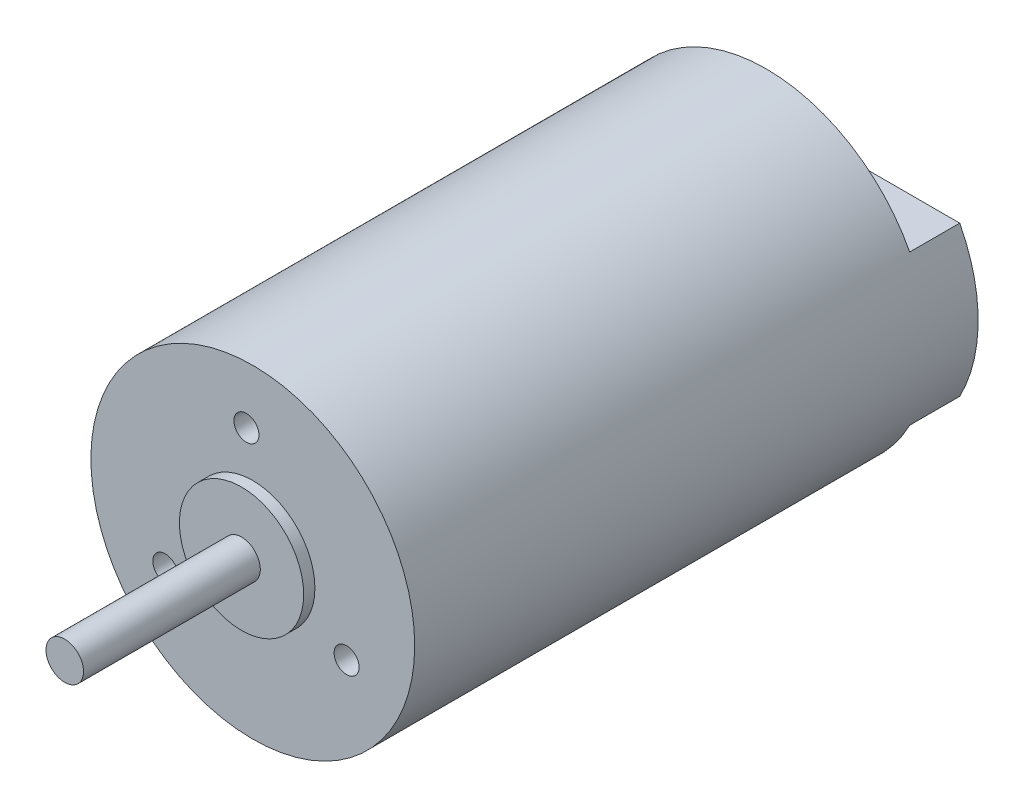
ISO-10303-21;
HEADER;
FILE_DESCRIPTION(('STEP AP214'),'2;1');
FILE_NAME('part.step','',(''),(''),'','','');
FILE_SCHEMA(('AUTOMOTIVE_DESIGN { 1 0 10303 214 1 1 1 1 }'));
ENDSEC;
DATA;
#1=APPLICATION_CONTEXT('core data for automotive mechanical design processes');
#2=APPLICATION_PROTOCOL_DEFINITION('international standard','automotive_design',2000,#1);
#3=PRODUCT_CONTEXT('',#1,'mechanical');
#4=PRODUCT('Part','Part','',(#3));
#5=PRODUCT_RELATED_PRODUCT_CATEGORY('part','',(#4));
#6=PRODUCT_DEFINITION_FORMATION('','',#4);
#7=PRODUCT_DEFINITION_CONTEXT('part definition',#1,'design');
#8=PRODUCT_DEFINITION('design','',#6,#7);
#9=PRODUCT_DEFINITION_SHAPE('','',#8);
#10=(LENGTH_UNIT() NAMED_UNIT(*) SI_UNIT(.MILLI.,.METRE.));
#11=(NAMED_UNIT(*) PLANE_ANGLE_UNIT() SI_UNIT($,.RADIAN.));
#12=(NAMED_UNIT(*) SI_UNIT($,.STERADIAN.) SOLID_ANGLE_UNIT());
#13=UNCERTAINTY_MEASURE_WITH_UNIT(LENGTH_MEASURE(1.E-05),#10,'distance_accuracy_value','');
#14=(GEOMETRIC_REPRESENTATION_CONTEXT(3) GLOBAL_UNCERTAINTY_ASSIGNED_CONTEXT((#13)) GLOBAL_UNIT_ASSIGNED_CONTEXT((#10,
#11,#12)) REPRESENTATION_CONTEXT('',''));
#15=CARTESIAN_POINT('',(0.,0.,0.));
#16=DIRECTION('',(0.,0.,1.));
#17=DIRECTION('',(1.,0.,0.));
#18=AXIS2_PLACEMENT_3D('',#15,#16,#17);
#19=CARTESIAN_POINT('',(0.,0.,0.));
#20=DIRECTION('',(0.,0.,1.));
#21=DIRECTION('',(1.,0.,0.));
#22=AXIS2_PLACEMENT_3D('',#19,#20,#21);
#23=PLANE('',#22);
#24=DIRECTION('',(-1.,0.,0.));
#25=VECTOR('',#24,1.);
#26=CARTESIAN_POINT('',(0.,-6.,0.));
#27=LINE('',#26,#25);
#28=CARTESIAN_POINT('',(11.4761709642197,-6.,0.));
#29=VERTEX_POINT('',#28);
#30=CARTESIAN_POINT('',(-11.4761709642197,-6.,0.));
#31=VERTEX_POINT('',#30);
#32=EDGE_CURVE('E49',#29,#31,#27,.T.);
#33=ORIENTED_EDGE('',*,*,#32,.F.);
#34=CARTESIAN_POINT('',(0.,0.,0.));
#35=DIRECTION('',(0.,0.,1.));
#36=DIRECTION('',(1.,0.,0.));
#37=AXIS2_PLACEMENT_3D('',#34,#35,#36);
#38=CIRCLE('',#37,12.95);
#39=EDGE_CURVE('E128',#31,#29,#38,.T.);
#40=ORIENTED_EDGE('',*,*,#39,.F.);
#41=EDGE_LOOP('',(#33,#40));
#42=FACE_BOUND('',#41,.T.);
#43=ADVANCED_FACE('F33',(#42),#23,.F.);
#44=CARTESIAN_POINT('',(0.,0.,41.97));
#45=DIRECTION('',(0.,0.,1.));
#46=DIRECTION('',(1.,0.,0.));
#47=AXIS2_PLACEMENT_3D('',#44,#45,#46);
#48=PLANE('',#47);
#49=CARTESIAN_POINT('',(0.,0.,41.97));
#50=DIRECTION('',(0.,0.,1.));
#51=DIRECTION('',(1.,0.,0.));
#52=AXIS2_PLACEMENT_3D('',#49,#50,#51);
#53=CIRCLE('',#52,4.97);
#54=CARTESIAN_POINT('',(4.97,0.,41.97));
#55=VERTEX_POINT('',#54);
#56=EDGE_CURVE('E130',#55,#55,#53,.T.);
#57=ORIENTED_EDGE('',*,*,#56,.T.);
#58=EDGE_LOOP('',(#57));
#59=FACE_BOUND('',#58,.T.);
#60=CARTESIAN_POINT('',(0.,0.,41.97));
#61=DIRECTION('',(0.,0.,1.));
#62=DIRECTION('',(1.,0.,0.));
#63=AXIS2_PLACEMENT_3D('',#60,#61,#62);
#64=CIRCLE('',#63,1.5);
#65=CARTESIAN_POINT('',(-1.5,0.,41.97));
#66=VERTEX_POINT('',#65);
#67=EDGE_CURVE('E141',#66,#66,#64,.T.);
#68=ORIENTED_EDGE('',*,*,#67,.F.);
#69=EDGE_LOOP('',(#68));
#70=FACE_BOUND('',#69,.T.);
#71=ADVANCED_FACE('F168',(#59,#70),#48,.T.);
#72=CARTESIAN_POINT('',(0.,0.,41.07));
#73=DIRECTION('',(0.,0.,1.));
#74=DIRECTION('',(1.,0.,0.));
#75=AXIS2_PLACEMENT_3D('',#72,#73,#74);
#76=PLANE('',#75);
#77=CARTESIAN_POINT('',(-0.508072965356447,8.36131323140124,41.07));
#78=DIRECTION('',(0.,0.,1.));
#79=DIRECTION('',(1.,0.,0.));
#80=AXIS2_PLACEMENT_3D('',#77,#78,#79);
#81=CIRCLE('',#80,0.999999999999989);
#82=CARTESIAN_POINT('',(0.491927034643542,8.36131323140124,41.07));
#83=VERTEX_POINT('',#82);
#84=EDGE_CURVE('E92',#83,#83,#81,.T.);
#85=ORIENTED_EDGE('',*,*,#84,.F.);
#86=EDGE_LOOP('',(#85));
#87=FACE_BOUND('',#86,.T.);
#88=CARTESIAN_POINT('',(7.50309849036857,-3.72467584301782,41.07));
#89=DIRECTION('',(0.,0.,1.));
#90=DIRECTION('',(1.,0.,0.));
#91=AXIS2_PLACEMENT_3D('',#88,#89,#90);
#92=CIRCLE('',#91,0.99999999999999);
#93=CARTESIAN_POINT('',(8.50309849036856,-3.72467584301782,41.07));
#94=VERTEX_POINT('',#93);
#95=EDGE_CURVE('E155',#94,#94,#92,.T.);
#96=ORIENTED_EDGE('',*,*,#95,.F.);
#97=EDGE_LOOP('',(#96));
#98=FACE_BOUND('',#97,.T.);
#99=CARTESIAN_POINT('',(-6.99690150963143,-4.60576447034028,41.07));
#100=DIRECTION('',(0.,0.,1.));
#101=DIRECTION('',(1.,0.,0.));
#102=AXIS2_PLACEMENT_3D('',#99,#100,#101);
#103=CIRCLE('',#102,0.999999999999989);
#104=CARTESIAN_POINT('',(-5.99690150963144,-4.60576447034028,41.07));
#105=VERTEX_POINT('',#104);
#106=EDGE_CURVE('E149',#105,#105,#103,.T.);
#107=ORIENTED_EDGE('',*,*,#106,.F.);
#108=EDGE_LOOP('',(#107));
#109=FACE_BOUND('',#108,.T.);
#110=CARTESIAN_POINT('',(0.,0.,41.07));
#111=DIRECTION('',(0.,0.,1.));
#112=DIRECTION('',(1.,0.,0.));
#113=AXIS2_PLACEMENT_3D('',#110,#111,#112);
#114=CIRCLE('',#113,12.95);
#115=CARTESIAN_POINT('',(12.95,0.,41.07));
#116=VERTEX_POINT('',#115);
#117=EDGE_CURVE('E11',#116,#116,#114,.T.);
#118=ORIENTED_EDGE('',*,*,#117,.T.);
#119=EDGE_LOOP('',(#118));
#120=FACE_BOUND('',#119,.T.);
#121=CARTESIAN_POINT('',(0.,0.,41.07));
#122=DIRECTION('',(0.,0.,1.));
#123=DIRECTION('',(1.,0.,0.));
#124=AXIS2_PLACEMENT_3D('',#121,#122,#123);
#125=CIRCLE('',#124,4.97);
#126=CARTESIAN_POINT('',(4.97,0.,41.07));
#127=VERTEX_POINT('',#126);
#128=EDGE_CURVE('E135',#127,#127,#125,.T.);
#129=ORIENTED_EDGE('',*,*,#128,.F.);
#130=EDGE_LOOP('',(#129));
#131=FACE_BOUND('',#130,.T.);
#132=ADVANCED_FACE('F165',(#87,#98,#109,#120,#131),#76,.T.);
#133=CARTESIAN_POINT('',(0.,0.,41.07));
#134=DIRECTION('',(0.,0.,-1.));
#135=DIRECTION('',(-1.,0.,0.));
#136=AXIS2_PLACEMENT_3D('',#133,#134,#135);
#137=CYLINDRICAL_SURFACE('',#136,12.95);
#138=ORIENTED_EDGE('',*,*,#117,.F.);
#139=EDGE_LOOP('',(#138));
#140=FACE_BOUND('',#139,.T.);
#141=CARTESIAN_POINT('',(11.4761709642197,6.,0.));
#142=VERTEX_POINT('',#141);
#143=CARTESIAN_POINT('',(-11.4761709642197,6.,0.));
#144=VERTEX_POINT('',#143);
#145=EDGE_CURVE('E42',#142,#144,#38,.T.);
#146=ORIENTED_EDGE('',*,*,#145,.T.);
#147=DIRECTION('',(0.,0.,1.));
#148=VECTOR('',#147,1.);
#149=CARTESIAN_POINT('',(-11.4761709642197,6.,-4.));
#150=LINE('',#149,#148);
#151=CARTESIAN_POINT('',(-11.4761709642197,6.,-4.));
#152=VERTEX_POINT('',#151);
#153=EDGE_CURVE('E117',#152,#144,#150,.T.);
#154=ORIENTED_EDGE('',*,*,#153,.F.);
#155=CARTESIAN_POINT('',(0.,0.,-4.));
#156=DIRECTION('',(0.,0.,-1.));
#157=DIRECTION('',(-1.,0.,0.));
#158=AXIS2_PLACEMENT_3D('',#155,#156,#157);
#159=CIRCLE('',#158,12.95);
#160=CARTESIAN_POINT('',(-11.4761709642197,-6.,-4.));
#161=VERTEX_POINT('',#160);
#162=EDGE_CURVE('E102',#161,#152,#159,.T.);
#163=ORIENTED_EDGE('',*,*,#162,.F.);
#164=DIRECTION('',(0.,0.,1.));
#165=VECTOR('',#164,1.);
#166=CARTESIAN_POINT('',(-11.4761709642197,-6.,-4.));
#167=LINE('',#166,#165);
#168=EDGE_CURVE('E118',#161,#31,#167,.T.);
#169=ORIENTED_EDGE('',*,*,#168,.T.);
#170=ORIENTED_EDGE('',*,*,#39,.T.);
#171=DIRECTION('',(0.,0.,1.));
#172=VECTOR('',#171,1.);
#173=CARTESIAN_POINT('',(11.4761709642197,-6.,-4.));
#174=LINE('',#173,#172);
#175=CARTESIAN_POINT('',(11.4761709642197,-6.,-4.));
#176=VERTEX_POINT('',#175);
#177=EDGE_CURVE('E93',#176,#29,#174,.T.);
#178=ORIENTED_EDGE('',*,*,#177,.F.);
#179=CARTESIAN_POINT('',(11.4761709642197,6.,-4.));
#180=VERTEX_POINT('',#179);
#181=EDGE_CURVE('E96',#180,#176,#159,.T.);
#182=ORIENTED_EDGE('',*,*,#181,.F.);
#183=DIRECTION('',(0.,0.,1.));
#184=VECTOR('',#183,1.);
#185=CARTESIAN_POINT('',(11.4761709642197,6.,-4.));
#186=LINE('',#185,#184);
#187=EDGE_CURVE('E85',#180,#142,#186,.T.);
#188=ORIENTED_EDGE('',*,*,#187,.T.);
#189=EDGE_LOOP('',(#146,#154,#163,#169,#170,#178,#182,#188));
#190=FACE_BOUND('',#189,.T.);
#191=ADVANCED_FACE('F35',(#140,#190),#137,.T.);
#192=ORIENTED_EDGE('',*,*,#145,.F.);
#193=DIRECTION('',(-1.,0.,0.));
#194=VECTOR('',#193,1.);
#195=CARTESIAN_POINT('',(0.,6.,0.));
#196=LINE('',#195,#194);
#197=EDGE_CURVE('E56',#142,#144,#196,.T.);
#198=ORIENTED_EDGE('',*,*,#197,.T.);
#199=EDGE_LOOP('',(#192,#198));
#200=FACE_BOUND('',#199,.T.);
#201=ADVANCED_FACE('F181',(#200),#23,.F.);
#202=CARTESIAN_POINT('',(0.,0.,41.97));
#203=DIRECTION('',(0.,0.,-1.));
#204=DIRECTION('',(-1.,0.,0.));
#205=AXIS2_PLACEMENT_3D('',#202,#203,#204);
#206=CYLINDRICAL_SURFACE('',#205,4.97);
#207=ORIENTED_EDGE('',*,*,#56,.F.);
#208=EDGE_LOOP('',(#207));
#209=FACE_BOUND('',#208,.T.);
#210=ORIENTED_EDGE('',*,*,#128,.T.);
#211=EDGE_LOOP('',(#210));
#212=FACE_BOUND('',#211,.T.);
#213=ADVANCED_FACE('F178',(#209,#212),#206,.T.);
#214=CARTESIAN_POINT('',(0.,0.,56.11));
#215=DIRECTION('',(0.,0.,-1.));
#216=DIRECTION('',(-1.,0.,0.));
#217=AXIS2_PLACEMENT_3D('',#214,#215,#216);
#218=CYLINDRICAL_SURFACE('',#217,1.5);
#219=CARTESIAN_POINT('',(0.,0.,56.11));
#220=DIRECTION('',(0.,0.,1.));
#221=DIRECTION('',(1.,0.,0.));
#222=AXIS2_PLACEMENT_3D('',#219,#220,#221);
#223=CIRCLE('',#222,1.5);
#224=CARTESIAN_POINT('',(-1.5,0.,56.11));
#225=VERTEX_POINT('',#224);
#226=EDGE_CURVE('E138',#225,#225,#223,.T.);
#227=CARTESIAN_POINT('',(-1.5,0.,56.11));
#228=CARTESIAN_POINT('',(-1.5,0.,55.9627083333333));
#229=CARTESIAN_POINT('',(-1.5,0.,55.8154166666667));
#230=CARTESIAN_POINT('',(-1.5,0.,55.5208333333333));
#231=CARTESIAN_POINT('',(-1.5,0.,55.3735416666667));
#232=CARTESIAN_POINT('',(-1.5,0.,55.0789583333333));
#233=CARTESIAN_POINT('',(-1.5,0.,54.9316666666667));
#234=CARTESIAN_POINT('',(-1.5,0.,54.6370833333333));
#235=CARTESIAN_POINT('',(-1.5,0.,54.4897916666667));
#236=CARTESIAN_POINT('',(-1.5,0.,54.1952083333333));
#237=CARTESIAN_POINT('',(-1.5,0.,54.0479166666667));
#238=CARTESIAN_POINT('',(-1.5,0.,53.7533333333333));
#239=CARTESIAN_POINT('',(-1.5,0.,53.6060416666667));
#240=CARTESIAN_POINT('',(-1.5,0.,53.3114583333333));
#241=CARTESIAN_POINT('',(-1.5,0.,53.1641666666667));
#242=CARTESIAN_POINT('',(-1.5,0.,52.8695833333333));
#243=CARTESIAN_POINT('',(-1.5,0.,52.7222916666667));
#244=CARTESIAN_POINT('',(-1.5,0.,52.4277083333333));
#245=CARTESIAN_POINT('',(-1.5,0.,52.2804166666667));
#246=CARTESIAN_POINT('',(-1.5,0.,51.9858333333333));
#247=CARTESIAN_POINT('',(-1.5,0.,51.8385416666667));
#248=CARTESIAN_POINT('',(-1.5,0.,51.5439583333333));
#249=CARTESIAN_POINT('',(-1.5,0.,51.3966666666667));
#250=CARTESIAN_POINT('',(-1.5,0.,51.1020833333333));
#251=CARTESIAN_POINT('',(-1.5,0.,50.9547916666667));
#252=CARTESIAN_POINT('',(-1.5,0.,50.6602083333333));
#253=CARTESIAN_POINT('',(-1.5,0.,50.5129166666667));
#254=CARTESIAN_POINT('',(-1.5,0.,50.2183333333333));
#255=CARTESIAN_POINT('',(-1.5,0.,50.0710416666667));
#256=CARTESIAN_POINT('',(-1.5,0.,49.7764583333333));
#257=CARTESIAN_POINT('',(-1.5,0.,49.6291666666667));
#258=CARTESIAN_POINT('',(-1.5,0.,49.3345833333333));
#259=CARTESIAN_POINT('',(-1.5,0.,49.1872916666667));
#260=CARTESIAN_POINT('',(-1.5,0.,48.8927083333333));
#261=CARTESIAN_POINT('',(-1.5,0.,48.7454166666667));
#262=CARTESIAN_POINT('',(-1.5,0.,48.4508333333333));
#263=CARTESIAN_POINT('',(-1.5,0.,48.3035416666667));
#264=CARTESIAN_POINT('',(-1.5,0.,48.0089583333333));
#265=CARTESIAN_POINT('',(-1.5,0.,47.8616666666667));
#266=CARTESIAN_POINT('',(-1.5,0.,47.5670833333333));
#267=CARTESIAN_POINT('',(-1.5,0.,47.4197916666667));
#268=CARTESIAN_POINT('',(-1.5,0.,47.1252083333333));
#269=CARTESIAN_POINT('',(-1.5,0.,46.9779166666667));
#270=CARTESIAN_POINT('',(-1.5,0.,46.6833333333333));
#271=CARTESIAN_POINT('',(-1.5,0.,46.5360416666667));
#272=CARTESIAN_POINT('',(-1.5,0.,46.2414583333333));
#273=CARTESIAN_POINT('',(-1.5,0.,46.0941666666667));
#274=CARTESIAN_POINT('',(-1.5,0.,45.7995833333333));
#275=CARTESIAN_POINT('',(-1.5,0.,45.6522916666667));
#276=CARTESIAN_POINT('',(-1.5,0.,45.3577083333333));
#277=CARTESIAN_POINT('',(-1.5,0.,45.2104166666667));
#278=CARTESIAN_POINT('',(-1.5,0.,44.9158333333333));
#279=CARTESIAN_POINT('',(-1.5,0.,44.7685416666667));
#280=CARTESIAN_POINT('',(-1.5,0.,44.4739583333333));
#281=CARTESIAN_POINT('',(-1.5,0.,44.3266666666667));
#282=CARTESIAN_POINT('',(-1.5,0.,44.0320833333333));
#283=CARTESIAN_POINT('',(-1.5,0.,43.8847916666667));
#284=CARTESIAN_POINT('',(-1.5,0.,43.5902083333333));
#285=CARTESIAN_POINT('',(-1.5,0.,43.4429166666667));
#286=CARTESIAN_POINT('',(-1.5,0.,43.1483333333333));
#287=CARTESIAN_POINT('',(-1.5,0.,43.0010416666667));
#288=CARTESIAN_POINT('',(-1.5,0.,42.7064583333333));
#289=CARTESIAN_POINT('',(-1.5,0.,42.5591666666667));
#290=CARTESIAN_POINT('',(-1.5,0.,42.2645833333333));
#291=CARTESIAN_POINT('',(-1.5,0.,42.1172916666667));
#292=CARTESIAN_POINT('',(-1.5,0.,41.97));
#293=B_SPLINE_CURVE_WITH_KNOTS('',3,(#227,#228,#229,#230,#231,#232,#233,#234,#235,#236,#237,
#238,#239,#240,#241,#242,#243,#244,#245,#246,#247,#248,#249,#250,#251,#252,#253,#254,#255,#256,
#257,#258,#259,#260,#261,#262,#263,#264,#265,#266,#267,#268,#269,#270,#271,#272,#273,#274,#275,
#276,#277,#278,#279,#280,#281,#282,#283,#284,#285,#286,#287,#288,#289,#290,#291,#292),
.UNSPECIFIED.,.F.,.F.,(4,2,2,2,2,2,2,2,2,2,2,2,2,2,2,2,2,2,2,2,2,2,2,2,2,2,2,2,2,2,2,2,4),(0.,
0.441875000000001,0.883750000000003,1.325625,1.76750000000001,2.20937500000001,2.65125,3.093125,
3.535,3.976875,4.41875000000001,4.860625,5.3025,5.744375,6.18625,6.62812500000001,7.07,7.511875,
7.95375,8.395625,8.83750000000001,9.279375,9.72125,10.163125,10.605,11.046875,11.48875,
11.930625,12.3725,12.814375,13.25625,13.698125,14.14),.UNSPECIFIED.);
#294=EDGE_CURVE('BSEAM180',#225,#66,#293,.T.);
#295=ORIENTED_EDGE('',*,*,#226,.F.);
#296=ORIENTED_EDGE('',*,*,#67,.T.);
#297=ORIENTED_EDGE('',*,*,#294,.T.);
#298=ORIENTED_EDGE('',*,*,#294,.F.);
#299=EDGE_LOOP('',(#295,#297,#296,#298));
#300=FACE_BOUND('',#299,.T.);
#301=ADVANCED_FACE('F180',(#300),#218,.T.);
#302=CARTESIAN_POINT('',(0.,0.,56.11));
#303=DIRECTION('',(0.,0.,1.));
#304=DIRECTION('',(1.,0.,0.));
#305=AXIS2_PLACEMENT_3D('',#302,#303,#304);
#306=PLANE('',#305);
#307=ORIENTED_EDGE('',*,*,#226,.T.);
#308=EDGE_LOOP('',(#307));
#309=FACE_BOUND('',#308,.T.);
#310=ADVANCED_FACE('F188',(#309),#306,.T.);
#311=CARTESIAN_POINT('',(-6.99690150963143,-4.60576447034028,36.07));
#312=DIRECTION('',(0.,0.,1.));
#313=DIRECTION('',(1.,0.,0.));
#314=AXIS2_PLACEMENT_3D('',#311,#312,#313);
#315=CONICAL_SURFACE('',#314,0.999999999999999,1.02974425867665);
#316=CARTESIAN_POINT('',(-6.99690150963144,-4.60576447034028,35.4691393809724));
#317=VERTEX_POINT('',#316);
#318=VERTEX_LOOP('',#317);
#319=FACE_BOUND('',#318,.T.);
#320=CARTESIAN_POINT('',(-6.99690150963143,-4.60576447034028,36.07));
#321=DIRECTION('',(0.,0.,1.));
#322=DIRECTION('',(1.,0.,0.));
#323=AXIS2_PLACEMENT_3D('',#320,#321,#322);
#324=CIRCLE('',#323,0.999999999999999);
#325=CARTESIAN_POINT('',(-5.99690150963143,-4.60576447034028,36.07));
#326=VERTEX_POINT('',#325);
#327=EDGE_CURVE('E144',#326,#326,#324,.T.);
#328=ORIENTED_EDGE('',*,*,#327,.T.);
#329=EDGE_LOOP('',(#328));
#330=FACE_BOUND('',#329,.T.);
#331=ADVANCED_FACE('F204',(#319,#330),#315,.F.);
#332=CARTESIAN_POINT('',(-6.99690150963143,-4.60576447034028,41.07));
#333=DIRECTION('',(0.,0.,1.));
#334=DIRECTION('',(1.,0.,0.));
#335=AXIS2_PLACEMENT_3D('',#332,#333,#334);
#336=CYLINDRICAL_SURFACE('',#335,0.999999999999994);
#337=ORIENTED_EDGE('',*,*,#327,.F.);
#338=EDGE_LOOP('',(#337));
#339=FACE_BOUND('',#338,.T.);
#340=ORIENTED_EDGE('',*,*,#106,.T.);
#341=EDGE_LOOP('',(#340));
#342=FACE_BOUND('',#341,.T.);
#343=ADVANCED_FACE('F208',(#339,#342),#336,.F.);
#344=CARTESIAN_POINT('',(7.50309849036857,-3.72467584301782,36.07));
#345=DIRECTION('',(0.,0.,1.));
#346=DIRECTION('',(1.,0.,0.));
#347=AXIS2_PLACEMENT_3D('',#344,#345,#346);
#348=CONICAL_SURFACE('',#347,0.999999999999998,1.02974425867665);
#349=CARTESIAN_POINT('',(7.50309849036856,-3.72467584301782,35.4691393809724));
#350=VERTEX_POINT('',#349);
#351=VERTEX_LOOP('',#350);
#352=FACE_BOUND('',#351,.T.);
#353=CARTESIAN_POINT('',(7.50309849036857,-3.72467584301782,36.07));
#354=DIRECTION('',(0.,0.,1.));
#355=DIRECTION('',(1.,0.,0.));
#356=AXIS2_PLACEMENT_3D('',#353,#354,#355);
#357=CIRCLE('',#356,0.999999999999998);
#358=CARTESIAN_POINT('',(8.50309849036856,-3.72467584301782,36.07));
#359=VERTEX_POINT('',#358);
#360=EDGE_CURVE('E152',#359,#359,#357,.T.);
#361=ORIENTED_EDGE('',*,*,#360,.T.);
#362=EDGE_LOOP('',(#361));
#363=FACE_BOUND('',#362,.T.);
#364=ADVANCED_FACE('F212',(#352,#363),#348,.F.);
#365=CARTESIAN_POINT('',(7.50309849036857,-3.72467584301782,41.07));
#366=DIRECTION('',(0.,0.,1.));
#367=DIRECTION('',(1.,0.,0.));
#368=AXIS2_PLACEMENT_3D('',#365,#366,#367);
#369=CYLINDRICAL_SURFACE('',#368,0.999999999999994);
#370=ORIENTED_EDGE('',*,*,#360,.F.);
#371=EDGE_LOOP('',(#370));
#372=FACE_BOUND('',#371,.T.);
#373=ORIENTED_EDGE('',*,*,#95,.T.);
#374=EDGE_LOOP('',(#373));
#375=FACE_BOUND('',#374,.T.);
#376=ADVANCED_FACE('F216',(#372,#375),#369,.F.);
#377=CARTESIAN_POINT('',(-0.508072965356447,8.36131323140124,36.07));
#378=DIRECTION('',(0.,0.,1.));
#379=DIRECTION('',(1.,0.,0.));
#380=AXIS2_PLACEMENT_3D('',#377,#378,#379);
#381=CONICAL_SURFACE('',#380,0.999999999999999,1.02974425867665);
#382=CARTESIAN_POINT('',(-0.508072965356448,8.36131323140124,35.4691393809724));
#383=VERTEX_POINT('',#382);
#384=VERTEX_LOOP('',#383);
#385=FACE_BOUND('',#384,.T.);
#386=CARTESIAN_POINT('',(-0.508072965356447,8.36131323140124,36.07));
#387=DIRECTION('',(0.,0.,1.));
#388=DIRECTION('',(1.,0.,0.));
#389=AXIS2_PLACEMENT_3D('',#386,#387,#388);
#390=CIRCLE('',#389,0.999999999999999);
#391=CARTESIAN_POINT('',(0.491927034643552,8.36131323140124,36.07));
#392=VERTEX_POINT('',#391);
#393=EDGE_CURVE('E158',#392,#392,#390,.T.);
#394=ORIENTED_EDGE('',*,*,#393,.T.);
#395=EDGE_LOOP('',(#394));
#396=FACE_BOUND('',#395,.T.);
#397=ADVANCED_FACE('F220',(#385,#396),#381,.F.);
#398=CARTESIAN_POINT('',(-0.508072965356447,8.36131323140124,41.07));
#399=DIRECTION('',(0.,0.,1.));
#400=DIRECTION('',(1.,0.,0.));
#401=AXIS2_PLACEMENT_3D('',#398,#399,#400);
#402=CYLINDRICAL_SURFACE('',#401,0.999999999999994);
#403=ORIENTED_EDGE('',*,*,#393,.F.);
#404=EDGE_LOOP('',(#403));
#405=FACE_BOUND('',#404,.T.);
#406=ORIENTED_EDGE('',*,*,#84,.T.);
#407=EDGE_LOOP('',(#406));
#408=FACE_BOUND('',#407,.T.);
#409=ADVANCED_FACE('F163',(#405,#408),#402,.F.);
#410=CARTESIAN_POINT('',(0.,6.,-4.));
#411=DIRECTION('',(0.,1.,0.));
#412=DIRECTION('',(-1.,0.,0.));
#413=AXIS2_PLACEMENT_3D('',#410,#411,#412);
#414=PLANE('',#413);
#415=ORIENTED_EDGE('',*,*,#197,.F.);
#416=ORIENTED_EDGE('',*,*,#187,.F.);
#417=DIRECTION('',(-1.,0.,0.));
#418=VECTOR('',#417,1.);
#419=CARTESIAN_POINT('',(0.,6.,-4.));
#420=LINE('',#419,#418);
#421=EDGE_CURVE('E90',#180,#152,#420,.T.);
#422=ORIENTED_EDGE('',*,*,#421,.T.);
#423=ORIENTED_EDGE('',*,*,#153,.T.);
#424=EDGE_LOOP('',(#415,#416,#422,#423));
#425=FACE_BOUND('',#424,.T.);
#426=ADVANCED_FACE('F87',(#425),#414,.T.);
#427=CARTESIAN_POINT('',(0.,-6.,-4.));
#428=DIRECTION('',(0.,1.,0.));
#429=DIRECTION('',(-1.,0.,0.));
#430=AXIS2_PLACEMENT_3D('',#427,#428,#429);
#431=PLANE('',#430);
#432=ORIENTED_EDGE('',*,*,#32,.T.);
#433=ORIENTED_EDGE('',*,*,#168,.F.);
#434=DIRECTION('',(-1.,0.,0.));
#435=VECTOR('',#434,1.);
#436=CARTESIAN_POINT('',(0.,-6.,-4.));
#437=LINE('',#436,#435);
#438=EDGE_CURVE('E100',#176,#161,#437,.T.);
#439=ORIENTED_EDGE('',*,*,#438,.F.);
#440=ORIENTED_EDGE('',*,*,#177,.T.);
#441=EDGE_LOOP('',(#432,#433,#439,#440));
#442=FACE_BOUND('',#441,.T.);
#443=ADVANCED_FACE('F230',(#442),#431,.F.);
#444=CARTESIAN_POINT('',(0.,0.,-4.));
#445=DIRECTION('',(0.,0.,-1.));
#446=DIRECTION('',(-1.,0.,0.));
#447=AXIS2_PLACEMENT_3D('',#444,#445,#446);
#448=PLANE('',#447);
#449=ORIENTED_EDGE('',*,*,#421,.F.);
#450=ORIENTED_EDGE('',*,*,#181,.T.);
#451=ORIENTED_EDGE('',*,*,#438,.T.);
#452=ORIENTED_EDGE('',*,*,#162,.T.);
#453=EDGE_LOOP('',(#449,#450,#451,#452));
#454=FACE_BOUND('',#453,.T.);
#455=ADVANCED_FACE('F103',(#454),#448,.T.);
#456=CLOSED_SHELL('',(#43,#71,#132,#191,#201,#213,#301,#310,#331,#343,#364,#376,#397,#409,#426,
#443,#455));
#457=MANIFOLD_SOLID_BREP('B2',#456);
#458=ADVANCED_BREP_SHAPE_REPRESENTATION('',(#18,#457),#14);
#459=SHAPE_DEFINITION_REPRESENTATION(#9,#458);
ENDSEC;
END-ISO-10303-21;
